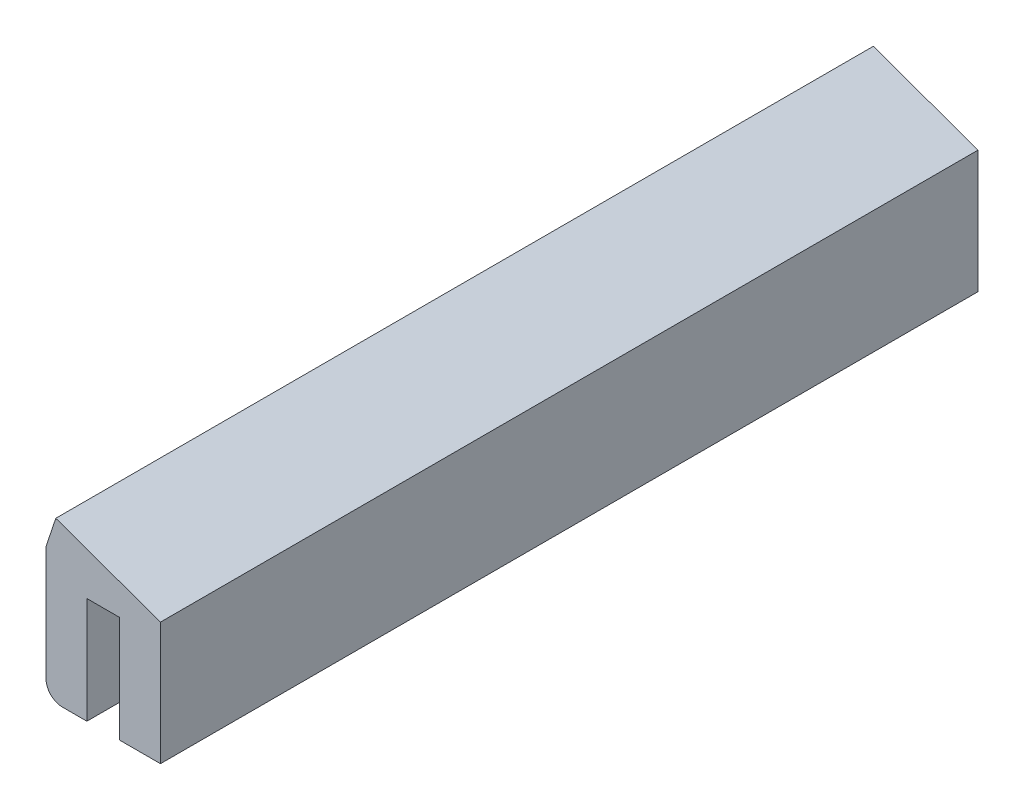
ISO-10303-21;
HEADER;
FILE_DESCRIPTION(('STEP AP214'),'2;1');
FILE_NAME('part.step','',(''),(''),'','','');
FILE_SCHEMA(('AUTOMOTIVE_DESIGN { 1 0 10303 214 1 1 1 1 }'));
ENDSEC;
DATA;
#1=APPLICATION_CONTEXT('core data for automotive mechanical design processes');
#2=APPLICATION_PROTOCOL_DEFINITION('international standard','automotive_design',2000,#1);
#3=PRODUCT_CONTEXT('',#1,'mechanical');
#4=PRODUCT('Part','Part','',(#3));
#5=PRODUCT_RELATED_PRODUCT_CATEGORY('part','',(#4));
#6=PRODUCT_DEFINITION_FORMATION('','',#4);
#7=PRODUCT_DEFINITION_CONTEXT('part definition',#1,'design');
#8=PRODUCT_DEFINITION('design','',#6,#7);
#9=PRODUCT_DEFINITION_SHAPE('','',#8);
#10=(LENGTH_UNIT() NAMED_UNIT(*) SI_UNIT(.MILLI.,.METRE.));
#11=(NAMED_UNIT(*) PLANE_ANGLE_UNIT() SI_UNIT($,.RADIAN.));
#12=(NAMED_UNIT(*) SI_UNIT($,.STERADIAN.) SOLID_ANGLE_UNIT());
#13=UNCERTAINTY_MEASURE_WITH_UNIT(LENGTH_MEASURE(1.E-05),#10,'distance_accuracy_value','');
#14=(GEOMETRIC_REPRESENTATION_CONTEXT(3) GLOBAL_UNCERTAINTY_ASSIGNED_CONTEXT((#13)) GLOBAL_UNIT_ASSIGNED_CONTEXT((#10,
#11,#12)) REPRESENTATION_CONTEXT('',''));
#15=CARTESIAN_POINT('',(0.,0.,0.));
#16=DIRECTION('',(0.,0.,1.));
#17=DIRECTION('',(1.,0.,0.));
#18=AXIS2_PLACEMENT_3D('',#15,#16,#17);
#19=CARTESIAN_POINT('',(0.,0.,0.));
#20=DIRECTION('',(-0.337873698429681,-0.941191459751654,0.));
#21=DIRECTION('',(0.941191459751654,-0.337873698429681,0.));
#22=AXIS2_PLACEMENT_3D('',#19,#20,#21);
#23=PLANE('',#22);
#24=DIRECTION('',(0.941191459751654,-0.337873698429681,0.));
#25=VECTOR('',#24,1.);
#26=CARTESIAN_POINT('',(0.,0.,100.));
#27=LINE('',#26,#25);
#28=CARTESIAN_POINT('',(-12.8033008588991,4.59619407771251,100.));
#29=VERTEX_POINT('',#28);
#30=CARTESIAN_POINT('',(0.,0.,100.));
#31=VERTEX_POINT('',#30);
#32=EDGE_CURVE('E44',#29,#31,#27,.T.);
#33=ORIENTED_EDGE('',*,*,#32,.T.);
#34=DIRECTION('',(0.,0.,-1.));
#35=VECTOR('',#34,1.);
#36=CARTESIAN_POINT('',(0.,0.,100.));
#37=LINE('',#36,#35);
#38=CARTESIAN_POINT('',(0.,0.,0.));
#39=VERTEX_POINT('',#38);
#40=EDGE_CURVE('E11',#31,#39,#37,.T.);
#41=ORIENTED_EDGE('',*,*,#40,.T.);
#42=DIRECTION('',(0.941191459751654,-0.337873698429681,0.));
#43=VECTOR('',#42,1.);
#44=CARTESIAN_POINT('',(0.,0.,0.));
#45=LINE('',#44,#43);
#46=CARTESIAN_POINT('',(-12.8033008588991,4.59619407771251,0.));
#47=VERTEX_POINT('',#46);
#48=EDGE_CURVE('E56',#47,#39,#45,.T.);
#49=ORIENTED_EDGE('',*,*,#48,.F.);
#50=DIRECTION('',(0.,0.,-1.));
#51=VECTOR('',#50,1.);
#52=CARTESIAN_POINT('',(-12.8033008588991,4.59619407771251,100.));
#53=LINE('',#52,#51);
#54=EDGE_CURVE('E192',#29,#47,#53,.T.);
#55=ORIENTED_EDGE('',*,*,#54,.F.);
#56=EDGE_LOOP('',(#33,#41,#49,#55));
#57=FACE_BOUND('',#56,.T.);
#58=ADVANCED_FACE('F41',(#57),#23,.F.);
#59=CARTESIAN_POINT('',(-14.,-15.,100.));
#60=DIRECTION('',(1.,0.,0.));
#61=DIRECTION('',(0.,1.,0.));
#62=AXIS2_PLACEMENT_3D('',#59,#60,#61);
#63=PLANE('',#62);
#64=DIRECTION('',(0.,-1.,0.));
#65=VECTOR('',#64,1.);
#66=CARTESIAN_POINT('',(-14.,-15.,0.));
#67=LINE('',#66,#65);
#68=CARTESIAN_POINT('',(-14.0000000000001,1.00000000000001,0.));
#69=VERTEX_POINT('',#68);
#70=CARTESIAN_POINT('',(-14.,-13.,0.));
#71=VERTEX_POINT('',#70);
#72=EDGE_CURVE('E159',#69,#71,#67,.T.);
#73=ORIENTED_EDGE('',*,*,#72,.T.);
#74=DIRECTION('',(0.,0.,-1.));
#75=VECTOR('',#74,1.);
#76=CARTESIAN_POINT('',(-14.,-13.,100.));
#77=LINE('',#76,#75);
#78=CARTESIAN_POINT('',(-14.,-13.,100.));
#79=VERTEX_POINT('',#78);
#80=EDGE_CURVE('E142',#71,#79,#77,.F.);
#81=ORIENTED_EDGE('',*,*,#80,.T.);
#82=DIRECTION('',(0.,-1.,0.));
#83=VECTOR('',#82,1.);
#84=CARTESIAN_POINT('',(-14.,-15.,100.));
#85=LINE('',#84,#83);
#86=CARTESIAN_POINT('',(-14.0000000000001,1.00000000000001,100.));
#87=VERTEX_POINT('',#86);
#88=EDGE_CURVE('E124',#87,#79,#85,.T.);
#89=ORIENTED_EDGE('',*,*,#88,.F.);
#90=DIRECTION('',(0.,0.,-1.));
#91=VECTOR('',#90,1.);
#92=CARTESIAN_POINT('',(-14.0000000000001,1.00000000000001,100.));
#93=LINE('',#92,#91);
#94=EDGE_CURVE('E131',#87,#69,#93,.T.);
#95=ORIENTED_EDGE('',*,*,#94,.T.);
#96=EDGE_LOOP('',(#73,#81,#89,#95));
#97=FACE_BOUND('',#96,.T.);
#98=ADVANCED_FACE('F140',(#97),#63,.F.);
#99=CARTESIAN_POINT('',(-12.,-13.,100.));
#100=DIRECTION('',(0.,0.,-1.));
#101=DIRECTION('',(-1.,0.,0.));
#102=AXIS2_PLACEMENT_3D('',#99,#100,#101);
#103=CYLINDRICAL_SURFACE('',#102,2.);
#104=CARTESIAN_POINT('',(-12.,-13.,100.));
#105=DIRECTION('',(0.,0.,1.));
#106=DIRECTION('',(1.,0.,0.));
#107=AXIS2_PLACEMENT_3D('',#104,#105,#106);
#108=CIRCLE('',#107,2.);
#109=CARTESIAN_POINT('',(-12.,-15.,100.));
#110=VERTEX_POINT('',#109);
#111=EDGE_CURVE('E190',#79,#110,#108,.T.);
#112=ORIENTED_EDGE('',*,*,#111,.F.);
#113=ORIENTED_EDGE('',*,*,#80,.F.);
#114=CARTESIAN_POINT('',(-12.,-13.,0.));
#115=DIRECTION('',(0.,0.,1.));
#116=DIRECTION('',(1.,0.,0.));
#117=AXIS2_PLACEMENT_3D('',#114,#115,#116);
#118=CIRCLE('',#117,2.);
#119=CARTESIAN_POINT('',(-12.,-15.,0.));
#120=VERTEX_POINT('',#119);
#121=EDGE_CURVE('E187',#120,#71,#118,.F.);
#122=ORIENTED_EDGE('',*,*,#121,.F.);
#123=DIRECTION('',(0.,0.,-1.));
#124=VECTOR('',#123,1.);
#125=CARTESIAN_POINT('',(-12.,-15.,100.));
#126=LINE('',#125,#124);
#127=EDGE_CURVE('E137',#110,#120,#126,.T.);
#128=ORIENTED_EDGE('',*,*,#127,.F.);
#129=EDGE_LOOP('',(#112,#113,#122,#128));
#130=FACE_BOUND('',#129,.T.);
#131=ADVANCED_FACE('F223',(#130),#103,.T.);
#132=CARTESIAN_POINT('',(-9.,-15.,100.));
#133=DIRECTION('',(0.,1.,0.));
#134=DIRECTION('',(-1.,0.,0.));
#135=AXIS2_PLACEMENT_3D('',#132,#133,#134);
#136=PLANE('',#135);
#137=DIRECTION('',(1.,0.,0.));
#138=VECTOR('',#137,1.);
#139=CARTESIAN_POINT('',(-9.,-15.,100.));
#140=LINE('',#139,#138);
#141=CARTESIAN_POINT('',(-9.,-15.,100.));
#142=VERTEX_POINT('',#141);
#143=EDGE_CURVE('E143',#110,#142,#140,.T.);
#144=ORIENTED_EDGE('',*,*,#143,.F.);
#145=ORIENTED_EDGE('',*,*,#127,.T.);
#146=DIRECTION('',(1.,0.,0.));
#147=VECTOR('',#146,1.);
#148=CARTESIAN_POINT('',(-9.,-15.,0.));
#149=LINE('',#148,#147);
#150=CARTESIAN_POINT('',(-9.,-15.,0.));
#151=VERTEX_POINT('',#150);
#152=EDGE_CURVE('E161',#120,#151,#149,.T.);
#153=ORIENTED_EDGE('',*,*,#152,.T.);
#154=DIRECTION('',(0.,0.,-1.));
#155=VECTOR('',#154,1.);
#156=CARTESIAN_POINT('',(-9.,-15.,100.));
#157=LINE('',#156,#155);
#158=EDGE_CURVE('E138',#142,#151,#157,.T.);
#159=ORIENTED_EDGE('',*,*,#158,.F.);
#160=EDGE_LOOP('',(#144,#145,#153,#159));
#161=FACE_BOUND('',#160,.T.);
#162=ADVANCED_FACE('F220',(#161),#136,.F.);
#163=CARTESIAN_POINT('',(-9.,-2.,100.));
#164=DIRECTION('',(-1.,0.,0.));
#165=DIRECTION('',(0.,-1.,0.));
#166=AXIS2_PLACEMENT_3D('',#163,#164,#165);
#167=PLANE('',#166);
#168=DIRECTION('',(0.,1.,0.));
#169=VECTOR('',#168,1.);
#170=CARTESIAN_POINT('',(-9.,-2.,0.));
#171=LINE('',#170,#169);
#172=CARTESIAN_POINT('',(-9.,-2.,0.));
#173=VERTEX_POINT('',#172);
#174=EDGE_CURVE('E163',#151,#173,#171,.T.);
#175=ORIENTED_EDGE('',*,*,#174,.T.);
#176=DIRECTION('',(0.,0.,-1.));
#177=VECTOR('',#176,1.);
#178=CARTESIAN_POINT('',(-9.,-2.,100.));
#179=LINE('',#178,#177);
#180=CARTESIAN_POINT('',(-9.,-2.,100.));
#181=VERTEX_POINT('',#180);
#182=EDGE_CURVE('E180',#181,#173,#179,.T.);
#183=ORIENTED_EDGE('',*,*,#182,.F.);
#184=DIRECTION('',(0.,1.,0.));
#185=VECTOR('',#184,1.);
#186=CARTESIAN_POINT('',(-9.,-2.,100.));
#187=LINE('',#186,#185);
#188=EDGE_CURVE('E145',#142,#181,#187,.T.);
#189=ORIENTED_EDGE('',*,*,#188,.F.);
#190=ORIENTED_EDGE('',*,*,#158,.T.);
#191=EDGE_LOOP('',(#175,#183,#189,#190));
#192=FACE_BOUND('',#191,.T.);
#193=ADVANCED_FACE('F215',(#192),#167,.F.);
#194=CARTESIAN_POINT('',(-5.,-2.,100.));
#195=DIRECTION('',(0.,1.,0.));
#196=DIRECTION('',(-1.,0.,0.));
#197=AXIS2_PLACEMENT_3D('',#194,#195,#196);
#198=PLANE('',#197);
#199=DIRECTION('',(1.,0.,0.));
#200=VECTOR('',#199,1.);
#201=CARTESIAN_POINT('',(-5.,-2.,0.));
#202=LINE('',#201,#200);
#203=CARTESIAN_POINT('',(-5.,-2.,0.));
#204=VERTEX_POINT('',#203);
#205=EDGE_CURVE('E165',#173,#204,#202,.T.);
#206=ORIENTED_EDGE('',*,*,#205,.T.);
#207=DIRECTION('',(0.,0.,-1.));
#208=VECTOR('',#207,1.);
#209=CARTESIAN_POINT('',(-5.,-2.,100.));
#210=LINE('',#209,#208);
#211=CARTESIAN_POINT('',(-5.,-2.,100.));
#212=VERTEX_POINT('',#211);
#213=EDGE_CURVE('E177',#212,#204,#210,.T.);
#214=ORIENTED_EDGE('',*,*,#213,.F.);
#215=DIRECTION('',(1.,0.,0.));
#216=VECTOR('',#215,1.);
#217=CARTESIAN_POINT('',(-5.,-2.,100.));
#218=LINE('',#217,#216);
#219=EDGE_CURVE('E149',#181,#212,#218,.T.);
#220=ORIENTED_EDGE('',*,*,#219,.F.);
#221=ORIENTED_EDGE('',*,*,#182,.T.);
#222=EDGE_LOOP('',(#206,#214,#220,#221));
#223=FACE_BOUND('',#222,.T.);
#224=ADVANCED_FACE('F210',(#223),#198,.F.);
#225=CARTESIAN_POINT('',(-5.,-15.,100.));
#226=DIRECTION('',(1.,0.,0.));
#227=DIRECTION('',(0.,0.,-1.));
#228=AXIS2_PLACEMENT_3D('',#225,#226,#227);
#229=PLANE('',#228);
#230=DIRECTION('',(0.,-1.,0.));
#231=VECTOR('',#230,1.);
#232=CARTESIAN_POINT('',(-5.,-15.,0.));
#233=LINE('',#232,#231);
#234=CARTESIAN_POINT('',(-5.,-15.,0.));
#235=VERTEX_POINT('',#234);
#236=EDGE_CURVE('E167',#204,#235,#233,.T.);
#237=ORIENTED_EDGE('',*,*,#236,.T.);
#238=DIRECTION('',(0.,0.,-1.));
#239=VECTOR('',#238,1.);
#240=CARTESIAN_POINT('',(-5.,-15.,100.));
#241=LINE('',#240,#239);
#242=CARTESIAN_POINT('',(-5.,-15.,100.));
#243=VERTEX_POINT('',#242);
#244=EDGE_CURVE('E174',#243,#235,#241,.T.);
#245=ORIENTED_EDGE('',*,*,#244,.F.);
#246=DIRECTION('',(0.,-1.,0.));
#247=VECTOR('',#246,1.);
#248=CARTESIAN_POINT('',(-5.,-15.,100.));
#249=LINE('',#248,#247);
#250=EDGE_CURVE('E151',#212,#243,#249,.T.);
#251=ORIENTED_EDGE('',*,*,#250,.F.);
#252=ORIENTED_EDGE('',*,*,#213,.T.);
#253=EDGE_LOOP('',(#237,#245,#251,#252));
#254=FACE_BOUND('',#253,.T.);
#255=ADVANCED_FACE('F206',(#254),#229,.F.);
#256=CARTESIAN_POINT('',(0.,-15.,100.));
#257=DIRECTION('',(0.,1.,0.));
#258=DIRECTION('',(-1.,0.,0.));
#259=AXIS2_PLACEMENT_3D('',#256,#257,#258);
#260=PLANE('',#259);
#261=DIRECTION('',(1.,0.,0.));
#262=VECTOR('',#261,1.);
#263=CARTESIAN_POINT('',(0.,-15.,0.));
#264=LINE('',#263,#262);
#265=CARTESIAN_POINT('',(0.,-15.,0.));
#266=VERTEX_POINT('',#265);
#267=EDGE_CURVE('E169',#235,#266,#264,.T.);
#268=ORIENTED_EDGE('',*,*,#267,.T.);
#269=DIRECTION('',(0.,0.,-1.));
#270=VECTOR('',#269,1.);
#271=CARTESIAN_POINT('',(0.,-15.,100.));
#272=LINE('',#271,#270);
#273=CARTESIAN_POINT('',(0.,-15.,100.));
#274=VERTEX_POINT('',#273);
#275=EDGE_CURVE('E157',#274,#266,#272,.T.);
#276=ORIENTED_EDGE('',*,*,#275,.F.);
#277=DIRECTION('',(1.,0.,0.));
#278=VECTOR('',#277,1.);
#279=CARTESIAN_POINT('',(0.,-15.,100.));
#280=LINE('',#279,#278);
#281=EDGE_CURVE('E153',#243,#274,#280,.T.);
#282=ORIENTED_EDGE('',*,*,#281,.F.);
#283=ORIENTED_EDGE('',*,*,#244,.T.);
#284=EDGE_LOOP('',(#268,#276,#282,#283));
#285=FACE_BOUND('',#284,.T.);
#286=ADVANCED_FACE('F202',(#285),#260,.F.);
#287=CARTESIAN_POINT('',(0.,0.,100.));
#288=DIRECTION('',(-1.,0.,0.));
#289=DIRECTION('',(0.,-1.,0.));
#290=AXIS2_PLACEMENT_3D('',#287,#288,#289);
#291=PLANE('',#290);
#292=DIRECTION('',(0.,1.,0.));
#293=VECTOR('',#292,1.);
#294=CARTESIAN_POINT('',(0.,0.,0.));
#295=LINE('',#294,#293);
#296=EDGE_CURVE('E128',#266,#39,#295,.T.);
#297=ORIENTED_EDGE('',*,*,#296,.T.);
#298=ORIENTED_EDGE('',*,*,#40,.F.);
#299=DIRECTION('',(0.,1.,0.));
#300=VECTOR('',#299,1.);
#301=CARTESIAN_POINT('',(0.,0.,100.));
#302=LINE('',#301,#300);
#303=EDGE_CURVE('E155',#274,#31,#302,.T.);
#304=ORIENTED_EDGE('',*,*,#303,.F.);
#305=ORIENTED_EDGE('',*,*,#275,.T.);
#306=EDGE_LOOP('',(#297,#298,#304,#305));
#307=FACE_BOUND('',#306,.T.);
#308=ADVANCED_FACE('F196',(#307),#291,.F.);
#309=CARTESIAN_POINT('',(-11.6066017177981,8.192388155425,100.));
#310=DIRECTION('',(0.948844033543414,-0.315745150412584,0.));
#311=DIRECTION('',(0.315745150412584,0.948844033543414,0.));
#312=AXIS2_PLACEMENT_3D('',#309,#310,#311);
#313=PLANE('',#312);
#314=DIRECTION('',(-0.315745150412584,-0.948844033543414,0.));
#315=VECTOR('',#314,1.);
#316=CARTESIAN_POINT('',(-11.6066017177981,8.192388155425,100.));
#317=LINE('',#316,#315);
#318=EDGE_CURVE('E120',#29,#87,#317,.T.);
#319=ORIENTED_EDGE('',*,*,#318,.F.);
#320=ORIENTED_EDGE('',*,*,#54,.T.);
#321=DIRECTION('',(-0.315745150412584,-0.948844033543414,0.));
#322=VECTOR('',#321,1.);
#323=CARTESIAN_POINT('',(-11.6066017177981,8.192388155425,0.));
#324=LINE('',#323,#322);
#325=EDGE_CURVE('E133',#47,#69,#324,.T.);
#326=ORIENTED_EDGE('',*,*,#325,.T.);
#327=ORIENTED_EDGE('',*,*,#94,.F.);
#328=EDGE_LOOP('',(#319,#320,#326,#327));
#329=FACE_BOUND('',#328,.T.);
#330=ADVANCED_FACE('F132',(#329),#313,.F.);
#331=CARTESIAN_POINT('',(0.,0.,0.));
#332=DIRECTION('',(0.,0.,1.));
#333=DIRECTION('',(1.,0.,0.));
#334=AXIS2_PLACEMENT_3D('',#331,#332,#333);
#335=PLANE('',#334);
#336=ORIENTED_EDGE('',*,*,#325,.F.);
#337=ORIENTED_EDGE('',*,*,#48,.T.);
#338=ORIENTED_EDGE('',*,*,#296,.F.);
#339=ORIENTED_EDGE('',*,*,#267,.F.);
#340=ORIENTED_EDGE('',*,*,#236,.F.);
#341=ORIENTED_EDGE('',*,*,#205,.F.);
#342=ORIENTED_EDGE('',*,*,#174,.F.);
#343=ORIENTED_EDGE('',*,*,#152,.F.);
#344=ORIENTED_EDGE('',*,*,#121,.T.);
#345=ORIENTED_EDGE('',*,*,#72,.F.);
#346=EDGE_LOOP('',(#336,#337,#338,#339,#340,#341,#342,#343,#344,#345));
#347=FACE_BOUND('',#346,.T.);
#348=ADVANCED_FACE('F199',(#347),#335,.F.);
#349=CARTESIAN_POINT('',(0.,0.,100.));
#350=DIRECTION('',(0.,0.,1.));
#351=DIRECTION('',(1.,0.,0.));
#352=AXIS2_PLACEMENT_3D('',#349,#350,#351);
#353=PLANE('',#352);
#354=ORIENTED_EDGE('',*,*,#32,.F.);
#355=ORIENTED_EDGE('',*,*,#318,.T.);
#356=ORIENTED_EDGE('',*,*,#88,.T.);
#357=ORIENTED_EDGE('',*,*,#111,.T.);
#358=ORIENTED_EDGE('',*,*,#143,.T.);
#359=ORIENTED_EDGE('',*,*,#188,.T.);
#360=ORIENTED_EDGE('',*,*,#219,.T.);
#361=ORIENTED_EDGE('',*,*,#250,.T.);
#362=ORIENTED_EDGE('',*,*,#281,.T.);
#363=ORIENTED_EDGE('',*,*,#303,.T.);
#364=EDGE_LOOP('',(#354,#355,#356,#357,#358,#359,#360,#361,#362,#363));
#365=FACE_BOUND('',#364,.T.);
#366=ADVANCED_FACE('F122',(#365),#353,.T.);
#367=CLOSED_SHELL('',(#58,#98,#131,#162,#193,#224,#255,#286,#308,#330,#348,#366));
#368=MANIFOLD_SOLID_BREP('B2',#367);
#369=ADVANCED_BREP_SHAPE_REPRESENTATION('',(#18,#368),#14);
#370=SHAPE_DEFINITION_REPRESENTATION(#9,#369);
ENDSEC;
END-ISO-10303-21;
